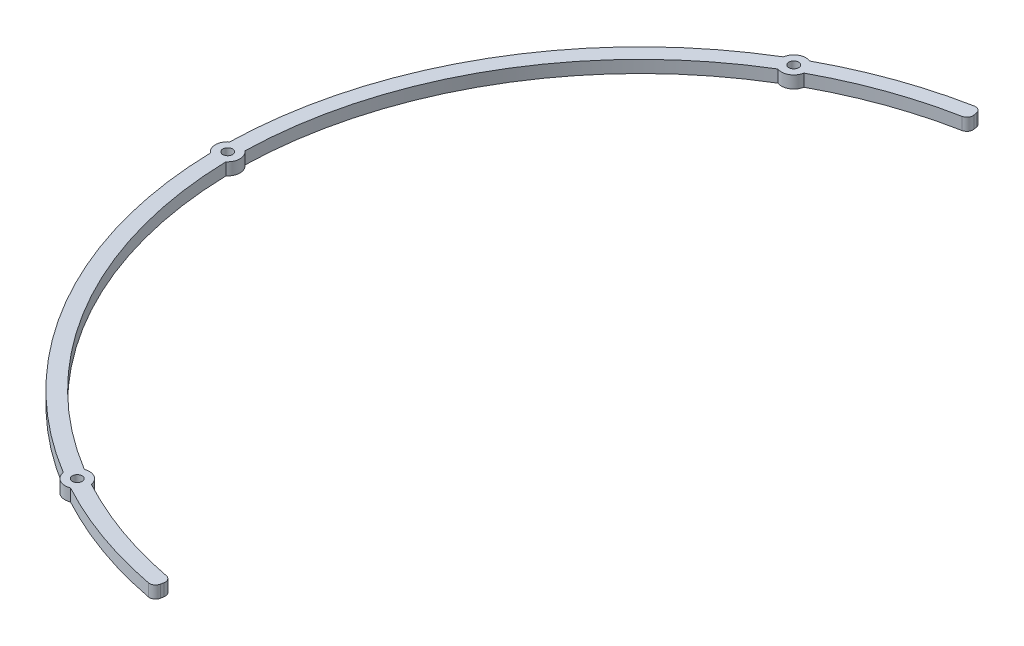
ISO-10303-21;
HEADER;
FILE_DESCRIPTION(('STEP AP214'),'2;1');
FILE_NAME('part.step','',(''),(''),'','','');
FILE_SCHEMA(('AUTOMOTIVE_DESIGN { 1 0 10303 214 1 1 1 1 }'));
ENDSEC;
DATA;
#1=APPLICATION_CONTEXT('core data for automotive mechanical design processes');
#2=APPLICATION_PROTOCOL_DEFINITION('international standard','automotive_design',2000,#1);
#3=PRODUCT_CONTEXT('',#1,'mechanical');
#4=PRODUCT('Part','Part','',(#3));
#5=PRODUCT_RELATED_PRODUCT_CATEGORY('part','',(#4));
#6=PRODUCT_DEFINITION_FORMATION('','',#4);
#7=PRODUCT_DEFINITION_CONTEXT('part definition',#1,'design');
#8=PRODUCT_DEFINITION('design','',#6,#7);
#9=PRODUCT_DEFINITION_SHAPE('','',#8);
#10=(LENGTH_UNIT() NAMED_UNIT(*) SI_UNIT(.MILLI.,.METRE.));
#11=(NAMED_UNIT(*) PLANE_ANGLE_UNIT() SI_UNIT($,.RADIAN.));
#12=(NAMED_UNIT(*) SI_UNIT($,.STERADIAN.) SOLID_ANGLE_UNIT());
#13=UNCERTAINTY_MEASURE_WITH_UNIT(LENGTH_MEASURE(1.E-05),#10,'distance_accuracy_value','');
#14=(GEOMETRIC_REPRESENTATION_CONTEXT(3) GLOBAL_UNCERTAINTY_ASSIGNED_CONTEXT((#13)) GLOBAL_UNIT_ASSIGNED_CONTEXT((#10,
#11,#12)) REPRESENTATION_CONTEXT('',''));
#15=CARTESIAN_POINT('',(0.,0.,0.));
#16=DIRECTION('',(0.,0.,1.));
#17=DIRECTION('',(1.,0.,0.));
#18=AXIS2_PLACEMENT_3D('',#15,#16,#17);
#19=CARTESIAN_POINT('',(0.,4.,0.));
#20=DIRECTION('',(0.,-1.,0.));
#21=DIRECTION('',(0.,0.,-1.));
#22=AXIS2_PLACEMENT_3D('',#19,#20,#21);
#23=CYLINDRICAL_SURFACE('',#22,137.);
#24=CARTESIAN_POINT('',(0.,0.,0.));
#25=DIRECTION('',(0.,1.,0.));
#26=DIRECTION('',(0.,0.,1.));
#27=AXIS2_PLACEMENT_3D('',#24,#25,#26);
#28=CIRCLE('',#27,137.);
#29=CARTESIAN_POINT('',(-25.7859845144308,0.,-134.551413974813));
#30=VERTEX_POINT('',#29);
#31=CARTESIAN_POINT('',(-65.2670573677867,0.,-120.454187235438));
#32=VERTEX_POINT('',#31);
#33=EDGE_CURVE('E192',#30,#32,#28,.T.);
#34=ORIENTED_EDGE('',*,*,#33,.T.);
#35=DIRECTION('',(0.,1.,0.));
#36=VECTOR('',#35,1.);
#37=CARTESIAN_POINT('',(-65.2670573677868,2.,-120.454187235438));
#38=LINE('',#37,#36);
#39=CARTESIAN_POINT('',(-65.2670573677867,4.,-120.454187235438));
#40=VERTEX_POINT('',#39);
#41=EDGE_CURVE('E67',#32,#40,#38,.T.);
#42=ORIENTED_EDGE('',*,*,#41,.T.);
#43=CARTESIAN_POINT('',(0.,4.,0.));
#44=DIRECTION('',(0.,1.,0.));
#45=DIRECTION('',(0.,0.,1.));
#46=AXIS2_PLACEMENT_3D('',#43,#44,#45);
#47=CIRCLE('',#46,137.);
#48=CARTESIAN_POINT('',(-25.7859845144308,4.,-134.551413974813));
#49=VERTEX_POINT('',#48);
#50=EDGE_CURVE('E311',#49,#40,#47,.T.);
#51=ORIENTED_EDGE('',*,*,#50,.F.);
#52=DIRECTION('',(0.,-1.,0.));
#53=VECTOR('',#52,1.);
#54=CARTESIAN_POINT('',(-25.7859845144309,4.,-134.551413974813));
#55=LINE('',#54,#53);
#56=EDGE_CURVE('E333',#49,#30,#55,.T.);
#57=ORIENTED_EDGE('',*,*,#56,.T.);
#58=EDGE_LOOP('',(#34,#42,#51,#57));
#59=FACE_BOUND('',#58,.T.);
#60=ADVANCED_FACE('F43',(#59),#23,.T.);
#61=CARTESIAN_POINT('',(0.,4.,0.));
#62=DIRECTION('',(0.,-1.,0.));
#63=DIRECTION('',(0.,0.,-1.));
#64=AXIS2_PLACEMENT_3D('',#61,#62,#63);
#65=CYLINDRICAL_SURFACE('',#64,132.);
#66=DIRECTION('',(0.,1.,0.));
#67=VECTOR('',#66,1.);
#68=CARTESIAN_POINT('',(-62.8349469227459,2.,-116.085181850293));
#69=LINE('',#68,#67);
#70=CARTESIAN_POINT('',(-62.8349469227459,0.,-116.085181850293));
#71=VERTEX_POINT('',#70);
#72=CARTESIAN_POINT('',(-62.8349469227459,4.,-116.085181850293));
#73=VERTEX_POINT('',#72);
#74=EDGE_CURVE('E201',#71,#73,#69,.T.);
#75=ORIENTED_EDGE('',*,*,#74,.F.);
#76=CARTESIAN_POINT('',(0.,0.,0.));
#77=DIRECTION('',(0.,1.,0.));
#78=DIRECTION('',(0.,0.,1.));
#79=AXIS2_PLACEMENT_3D('',#76,#77,#78);
#80=CIRCLE('',#79,132.);
#81=CARTESIAN_POINT('',(-24.8592244886957,0.,-129.638030522762));
#82=VERTEX_POINT('',#81);
#83=EDGE_CURVE('E319',#82,#71,#80,.T.);
#84=ORIENTED_EDGE('',*,*,#83,.F.);
#85=DIRECTION('',(0.,-1.,0.));
#86=VECTOR('',#85,1.);
#87=CARTESIAN_POINT('',(-24.8592244886957,4.,-129.638030522762));
#88=LINE('',#87,#86);
#89=CARTESIAN_POINT('',(-24.8592244886957,4.,-129.638030522762));
#90=VERTEX_POINT('',#89);
#91=EDGE_CURVE('E374',#82,#90,#88,.F.);
#92=ORIENTED_EDGE('',*,*,#91,.T.);
#93=CARTESIAN_POINT('',(0.,4.,0.));
#94=DIRECTION('',(0.,1.,0.));
#95=DIRECTION('',(0.,0.,1.));
#96=AXIS2_PLACEMENT_3D('',#93,#94,#95);
#97=CIRCLE('',#96,132.);
#98=EDGE_CURVE('E301',#90,#73,#97,.T.);
#99=ORIENTED_EDGE('',*,*,#98,.T.);
#100=EDGE_LOOP('',(#75,#84,#92,#99));
#101=FACE_BOUND('',#100,.T.);
#102=ADVANCED_FACE('F456',(#101),#65,.F.);
#103=CARTESIAN_POINT('',(-70.7377339790226,4.,-117.32507401026));
#104=VERTEX_POINT('',#103);
#105=CARTESIAN_POINT('',(-136.96375464684,4.,-3.15117645335468));
#106=VERTEX_POINT('',#105);
#107=EDGE_CURVE('E59',#104,#106,#47,.T.);
#108=ORIENTED_EDGE('',*,*,#107,.F.);
#109=DIRECTION('',(0.,1.,0.));
#110=VECTOR('',#109,1.);
#111=CARTESIAN_POINT('',(-70.7377339790222,2.,-117.32507401026));
#112=LINE('',#111,#110);
#113=CARTESIAN_POINT('',(-70.7377339790222,0.,-117.32507401026));
#114=VERTEX_POINT('',#113);
#115=EDGE_CURVE('E195',#104,#114,#112,.F.);
#116=ORIENTED_EDGE('',*,*,#115,.T.);
#117=CARTESIAN_POINT('',(-136.96375464684,0.,-3.15117645335468));
#118=VERTEX_POINT('',#117);
#119=EDGE_CURVE('E182',#114,#118,#28,.T.);
#120=ORIENTED_EDGE('',*,*,#119,.T.);
#121=DIRECTION('',(0.,1.,0.));
#122=VECTOR('',#121,1.);
#123=CARTESIAN_POINT('',(-136.96375464684,2.,-3.15117645335434));
#124=LINE('',#123,#122);
#125=EDGE_CURVE('E242',#118,#106,#124,.T.);
#126=ORIENTED_EDGE('',*,*,#125,.T.);
#127=EDGE_LOOP('',(#108,#116,#120,#126));
#128=FACE_BOUND('',#127,.T.);
#129=ADVANCED_FACE('F196',(#128),#23,.T.);
#130=DIRECTION('',(0.,1.,0.));
#131=VECTOR('',#130,1.);
#132=CARTESIAN_POINT('',(-68.2048523465057,2.,-113.013707648193));
#133=LINE('',#132,#131);
#134=CARTESIAN_POINT('',(-68.2048523465057,4.,-113.013707648193));
#135=VERTEX_POINT('',#134);
#136=CARTESIAN_POINT('',(-68.2048523465054,0.,-113.013707648194));
#137=VERTEX_POINT('',#136);
#138=EDGE_CURVE('E205',#135,#137,#133,.F.);
#139=ORIENTED_EDGE('',*,*,#138,.F.);
#140=CARTESIAN_POINT('',(-131.96375464684,4.,-3.09313102027258));
#141=VERTEX_POINT('',#140);
#142=EDGE_CURVE('E306',#135,#141,#97,.T.);
#143=ORIENTED_EDGE('',*,*,#142,.T.);
#144=DIRECTION('',(0.,1.,0.));
#145=VECTOR('',#144,1.);
#146=CARTESIAN_POINT('',(-131.96375464684,2.,-3.09313102027258));
#147=LINE('',#146,#145);
#148=CARTESIAN_POINT('',(-131.96375464684,0.,-3.09313102027258));
#149=VERTEX_POINT('',#148);
#150=EDGE_CURVE('E234',#149,#141,#147,.T.);
#151=ORIENTED_EDGE('',*,*,#150,.F.);
#152=EDGE_CURVE('E324',#137,#149,#80,.T.);
#153=ORIENTED_EDGE('',*,*,#152,.F.);
#154=EDGE_LOOP('',(#139,#143,#151,#153));
#155=FACE_BOUND('',#154,.T.);
#156=ADVANCED_FACE('F450',(#155),#65,.F.);
#157=CARTESIAN_POINT('',(-136.96375464684,4.,3.15117645335468));
#158=VERTEX_POINT('',#157);
#159=CARTESIAN_POINT('',(-70.7377339790226,4.,117.32507401026));
#160=VERTEX_POINT('',#159);
#161=EDGE_CURVE('E418',#158,#160,#47,.T.);
#162=ORIENTED_EDGE('',*,*,#161,.F.);
#163=DIRECTION('',(0.,1.,0.));
#164=VECTOR('',#163,1.);
#165=CARTESIAN_POINT('',(-136.96375464684,2.,3.15117645335434));
#166=LINE('',#165,#164);
#167=CARTESIAN_POINT('',(-136.96375464684,0.,3.15117645335434));
#168=VERTEX_POINT('',#167);
#169=EDGE_CURVE('E238',#158,#168,#166,.F.);
#170=ORIENTED_EDGE('',*,*,#169,.T.);
#171=CARTESIAN_POINT('',(-70.7377339790226,0.,117.32507401026));
#172=VERTEX_POINT('',#171);
#173=EDGE_CURVE('E193',#168,#172,#28,.T.);
#174=ORIENTED_EDGE('',*,*,#173,.T.);
#175=DIRECTION('',(0.,1.,0.));
#176=VECTOR('',#175,1.);
#177=CARTESIAN_POINT('',(-70.7377339790222,2.,117.32507401026));
#178=LINE('',#177,#176);
#179=EDGE_CURVE('E267',#172,#160,#178,.T.);
#180=ORIENTED_EDGE('',*,*,#179,.T.);
#181=EDGE_LOOP('',(#162,#170,#174,#180));
#182=FACE_BOUND('',#181,.T.);
#183=ADVANCED_FACE('F412',(#182),#23,.T.);
#184=DIRECTION('',(0.,1.,0.));
#185=VECTOR('',#184,1.);
#186=CARTESIAN_POINT('',(-131.96375464684,2.,3.09313102027258));
#187=LINE('',#186,#185);
#188=CARTESIAN_POINT('',(-131.96375464684,4.,3.09313102027258));
#189=VERTEX_POINT('',#188);
#190=CARTESIAN_POINT('',(-131.96375464684,0.,3.09313102027195));
#191=VERTEX_POINT('',#190);
#192=EDGE_CURVE('E225',#189,#191,#187,.F.);
#193=ORIENTED_EDGE('',*,*,#192,.F.);
#194=CARTESIAN_POINT('',(-68.2048523465057,4.,113.013707648193));
#195=VERTEX_POINT('',#194);
#196=EDGE_CURVE('E400',#189,#195,#97,.T.);
#197=ORIENTED_EDGE('',*,*,#196,.T.);
#198=DIRECTION('',(0.,1.,0.));
#199=VECTOR('',#198,1.);
#200=CARTESIAN_POINT('',(-68.2048523465057,2.,113.013707648193));
#201=LINE('',#200,#199);
#202=CARTESIAN_POINT('',(-68.2048523465057,0.,113.013707648193));
#203=VERTEX_POINT('',#202);
#204=EDGE_CURVE('E259',#203,#195,#201,.T.);
#205=ORIENTED_EDGE('',*,*,#204,.F.);
#206=EDGE_CURVE('E439',#191,#203,#80,.T.);
#207=ORIENTED_EDGE('',*,*,#206,.F.);
#208=EDGE_LOOP('',(#193,#197,#205,#207));
#209=FACE_BOUND('',#208,.T.);
#210=ADVANCED_FACE('F429',(#209),#65,.F.);
#211=CARTESIAN_POINT('',(-23.789800340369,4.,-134.918662162673));
#212=DIRECTION('',(0.984807753012209,0.,-0.173648177666927));
#213=DIRECTION('',(-0.173648177666927,0.,-0.984807753012209));
#214=AXIS2_PLACEMENT_3D('',#211,#212,#213);
#215=PLANE('',#214);
#216=DIRECTION('',(0.173648177666927,0.,0.984807753012209));
#217=VECTOR('',#216,1.);
#218=CARTESIAN_POINT('',(-23.789800340369,0.,-134.918662162673));
#219=LINE('',#218,#217);
#220=CARTESIAN_POINT('',(-23.4399312782688,0.,-132.934456111537));
#221=VERTEX_POINT('',#220);
#222=CARTESIAN_POINT('',(-23.2662638991667,0.,-131.949539461774));
#223=VERTEX_POINT('',#222);
#224=EDGE_CURVE('E281',#221,#223,#219,.T.);
#225=ORIENTED_EDGE('',*,*,#224,.F.);
#226=DIRECTION('',(0.,1.,0.));
#227=VECTOR('',#226,1.);
#228=CARTESIAN_POINT('',(-23.4399312782688,4.,-132.934456111537));
#229=LINE('',#228,#227);
#230=CARTESIAN_POINT('',(-23.4399312782688,4.,-132.934456111537));
#231=VERTEX_POINT('',#230);
#232=EDGE_CURVE('E354',#221,#231,#229,.T.);
#233=ORIENTED_EDGE('',*,*,#232,.T.);
#234=DIRECTION('',(0.173648177666927,0.,0.984807753012209));
#235=VECTOR('',#234,1.);
#236=CARTESIAN_POINT('',(-23.789800340369,4.,-134.918662162673));
#237=LINE('',#236,#235);
#238=CARTESIAN_POINT('',(-23.2662638991667,4.,-131.949539461774));
#239=VERTEX_POINT('',#238);
#240=EDGE_CURVE('E296',#231,#239,#237,.T.);
#241=ORIENTED_EDGE('',*,*,#240,.T.);
#242=DIRECTION('',(0.,-1.,0.));
#243=VECTOR('',#242,1.);
#244=CARTESIAN_POINT('',(-23.2662638991667,4.,-131.949539461774));
#245=LINE('',#244,#243);
#246=EDGE_CURVE('E350',#239,#223,#245,.T.);
#247=ORIENTED_EDGE('',*,*,#246,.T.);
#248=EDGE_LOOP('',(#225,#233,#241,#247));
#249=FACE_BOUND('',#248,.T.);
#250=ADVANCED_FACE('F464',(#249),#215,.T.);
#251=CARTESIAN_POINT('',(-65.2670573677867,4.,120.454187235438));
#252=VERTEX_POINT('',#251);
#253=CARTESIAN_POINT('',(-25.7859845144308,4.,134.551413974813));
#254=VERTEX_POINT('',#253);
#255=EDGE_CURVE('E310',#252,#254,#47,.T.);
#256=ORIENTED_EDGE('',*,*,#255,.F.);
#257=DIRECTION('',(0.,1.,0.));
#258=VECTOR('',#257,1.);
#259=CARTESIAN_POINT('',(-65.2670573677868,2.,120.454187235438));
#260=LINE('',#259,#258);
#261=CARTESIAN_POINT('',(-65.2670573677868,0.,120.454187235438));
#262=VERTEX_POINT('',#261);
#263=EDGE_CURVE('E263',#252,#262,#260,.F.);
#264=ORIENTED_EDGE('',*,*,#263,.T.);
#265=CARTESIAN_POINT('',(-25.7859845144308,0.,134.551413974813));
#266=VERTEX_POINT('',#265);
#267=EDGE_CURVE('E327',#262,#266,#28,.T.);
#268=ORIENTED_EDGE('',*,*,#267,.T.);
#269=DIRECTION('',(0.,-1.,0.));
#270=VECTOR('',#269,1.);
#271=CARTESIAN_POINT('',(-25.7859845144308,4.,134.551413974813));
#272=LINE('',#271,#270);
#273=EDGE_CURVE('E314',#266,#254,#272,.F.);
#274=ORIENTED_EDGE('',*,*,#273,.T.);
#275=EDGE_LOOP('',(#256,#264,#268,#274));
#276=FACE_BOUND('',#275,.T.);
#277=ADVANCED_FACE('F405',(#276),#23,.T.);
#278=CARTESIAN_POINT('',(-22.9215594520343,4.,129.994623397612));
#279=DIRECTION('',(0.984807753012209,0.,0.173648177666926));
#280=DIRECTION('',(0.173648177666926,0.,-0.984807753012209));
#281=AXIS2_PLACEMENT_3D('',#278,#279,#280);
#282=PLANE('',#281);
#283=DIRECTION('',(-0.173648177666926,0.,0.984807753012209));
#284=VECTOR('',#283,1.);
#285=CARTESIAN_POINT('',(-22.9215594520343,0.,129.994623397612));
#286=LINE('',#285,#284);
#287=CARTESIAN_POINT('',(-23.2662638991666,0.,131.949539461774));
#288=VERTEX_POINT('',#287);
#289=CARTESIAN_POINT('',(-23.4399312782687,0.,132.934456111537));
#290=VERTEX_POINT('',#289);
#291=EDGE_CURVE('E323',#288,#290,#286,.T.);
#292=ORIENTED_EDGE('',*,*,#291,.F.);
#293=DIRECTION('',(0.,-1.,0.));
#294=VECTOR('',#293,1.);
#295=CARTESIAN_POINT('',(-23.2662638991666,4.,131.949539461774));
#296=LINE('',#295,#294);
#297=CARTESIAN_POINT('',(-23.2662638991666,4.,131.949539461774));
#298=VERTEX_POINT('',#297);
#299=EDGE_CURVE('E11',#288,#298,#296,.F.);
#300=ORIENTED_EDGE('',*,*,#299,.T.);
#301=DIRECTION('',(-0.173648177666926,0.,0.984807753012209));
#302=VECTOR('',#301,1.);
#303=CARTESIAN_POINT('',(-22.9215594520343,4.,129.994623397612));
#304=LINE('',#303,#302);
#305=CARTESIAN_POINT('',(-23.4399312782687,4.,132.934456111537));
#306=VERTEX_POINT('',#305);
#307=EDGE_CURVE('E305',#298,#306,#304,.T.);
#308=ORIENTED_EDGE('',*,*,#307,.T.);
#309=DIRECTION('',(0.,1.,0.));
#310=VECTOR('',#309,1.);
#311=CARTESIAN_POINT('',(-23.4399312782687,0.,132.934456111537));
#312=LINE('',#311,#310);
#313=EDGE_CURVE('E52',#306,#290,#312,.F.);
#314=ORIENTED_EDGE('',*,*,#313,.T.);
#315=EDGE_LOOP('',(#292,#300,#308,#314));
#316=FACE_BOUND('',#315,.T.);
#317=ADVANCED_FACE('F381',(#316),#282,.T.);
#318=DIRECTION('',(0.,1.,0.));
#319=VECTOR('',#318,1.);
#320=CARTESIAN_POINT('',(-62.8349469227459,2.,116.085181850293));
#321=LINE('',#320,#319);
#322=CARTESIAN_POINT('',(-62.8349469227459,4.,116.085181850293));
#323=VERTEX_POINT('',#322);
#324=CARTESIAN_POINT('',(-62.8349469227467,0.,116.085181850293));
#325=VERTEX_POINT('',#324);
#326=EDGE_CURVE('E255',#323,#325,#321,.F.);
#327=ORIENTED_EDGE('',*,*,#326,.F.);
#328=CARTESIAN_POINT('',(-24.8592244886957,4.,129.638030522762));
#329=VERTEX_POINT('',#328);
#330=EDGE_CURVE('E300',#323,#329,#97,.T.);
#331=ORIENTED_EDGE('',*,*,#330,.T.);
#332=DIRECTION('',(0.,-1.,0.));
#333=VECTOR('',#332,1.);
#334=CARTESIAN_POINT('',(-24.8592244886957,4.,129.638030522762));
#335=LINE('',#334,#333);
#336=CARTESIAN_POINT('',(-24.8592244886957,0.,129.638030522762));
#337=VERTEX_POINT('',#336);
#338=EDGE_CURVE('E370',#329,#337,#335,.T.);
#339=ORIENTED_EDGE('',*,*,#338,.T.);
#340=EDGE_CURVE('E318',#325,#337,#80,.T.);
#341=ORIENTED_EDGE('',*,*,#340,.F.);
#342=EDGE_LOOP('',(#327,#331,#339,#341));
#343=FACE_BOUND('',#342,.T.);
#344=ADVANCED_FACE('F395',(#343),#65,.F.);
#345=CARTESIAN_POINT('',(0.,4.,0.));
#346=DIRECTION('',(0.,1.,0.));
#347=DIRECTION('',(0.,0.,1.));
#348=AXIS2_PLACEMENT_3D('',#345,#346,#347);
#349=PLANE('',#348);
#350=ORIENTED_EDGE('',*,*,#142,.F.);
#351=CARTESIAN_POINT('',(-66.7791434431441,4.,-116.751));
#352=DIRECTION('',(0.,1.,0.));
#353=DIRECTION('',(0.,0.,1.));
#354=AXIS2_PLACEMENT_3D('',#351,#352,#353);
#355=CIRCLE('',#354,4.00000000000001);
#356=EDGE_CURVE('E214',#135,#73,#355,.T.);
#357=ORIENTED_EDGE('',*,*,#356,.T.);
#358=ORIENTED_EDGE('',*,*,#98,.F.);
#359=CARTESIAN_POINT('',(-25.2358794051911,4.,-131.60224310644));
#360=DIRECTION('',(0.,1.,0.));
#361=DIRECTION('',(0.,0.,1.));
#362=AXIS2_PLACEMENT_3D('',#359,#360,#361);
#363=CIRCLE('',#362,2.);
#364=EDGE_CURVE('E364',#90,#239,#363,.T.);
#365=ORIENTED_EDGE('',*,*,#364,.T.);
#366=ORIENTED_EDGE('',*,*,#240,.F.);
#367=CARTESIAN_POINT('',(-25.4095467842932,4.,-132.587159756203));
#368=DIRECTION('',(0.,1.,0.));
#369=DIRECTION('',(0.,0.,1.));
#370=AXIS2_PLACEMENT_3D('',#367,#368,#369);
#371=CIRCLE('',#370,2.);
#372=EDGE_CURVE('E367',#231,#49,#371,.T.);
#373=ORIENTED_EDGE('',*,*,#372,.T.);
#374=ORIENTED_EDGE('',*,*,#50,.T.);
#375=EDGE_CURVE('E212',#40,#104,#355,.T.);
#376=ORIENTED_EDGE('',*,*,#375,.T.);
#377=ORIENTED_EDGE('',*,*,#107,.T.);
#378=CARTESIAN_POINT('',(-134.5,4.,0.));
#379=DIRECTION('',(0.,1.,0.));
#380=DIRECTION('',(0.,0.,1.));
#381=AXIS2_PLACEMENT_3D('',#378,#379,#380);
#382=CIRCLE('',#381,3.99999999999999);
#383=EDGE_CURVE('E222',#106,#158,#382,.T.);
#384=ORIENTED_EDGE('',*,*,#383,.T.);
#385=ORIENTED_EDGE('',*,*,#161,.T.);
#386=CARTESIAN_POINT('',(-66.7791434431441,4.,116.751));
#387=DIRECTION('',(0.,1.,0.));
#388=DIRECTION('',(0.,0.,1.));
#389=AXIS2_PLACEMENT_3D('',#386,#387,#388);
#390=CIRCLE('',#389,4.00000000000001);
#391=EDGE_CURVE('E245',#160,#252,#390,.T.);
#392=ORIENTED_EDGE('',*,*,#391,.T.);
#393=ORIENTED_EDGE('',*,*,#255,.T.);
#394=CARTESIAN_POINT('',(-25.4095467842931,4.,132.587159756203));
#395=DIRECTION('',(0.,1.,0.));
#396=DIRECTION('',(0.,0.,1.));
#397=AXIS2_PLACEMENT_3D('',#394,#395,#396);
#398=CIRCLE('',#397,2.);
#399=EDGE_CURVE('E357',#254,#306,#398,.T.);
#400=ORIENTED_EDGE('',*,*,#399,.T.);
#401=ORIENTED_EDGE('',*,*,#307,.F.);
#402=CARTESIAN_POINT('',(-25.2358794051911,4.,131.60224310644));
#403=DIRECTION('',(0.,1.,0.));
#404=DIRECTION('',(0.,0.,1.));
#405=AXIS2_PLACEMENT_3D('',#402,#403,#404);
#406=CIRCLE('',#405,2.);
#407=EDGE_CURVE('E360',#298,#329,#406,.T.);
#408=ORIENTED_EDGE('',*,*,#407,.T.);
#409=ORIENTED_EDGE('',*,*,#330,.F.);
#410=EDGE_CURVE('E251',#323,#195,#390,.T.);
#411=ORIENTED_EDGE('',*,*,#410,.T.);
#412=ORIENTED_EDGE('',*,*,#196,.F.);
#413=EDGE_CURVE('E227',#189,#141,#382,.T.);
#414=ORIENTED_EDGE('',*,*,#413,.T.);
#415=EDGE_LOOP('',(#350,#357,#358,#365,#366,#373,#374,#376,#377,#384,#385,#392,#393,#400,#401,
#408,#409,#411,#412,#414));
#416=FACE_BOUND('',#415,.T.);
#417=CARTESIAN_POINT('',(-66.7791434431441,4.,116.751));
#418=DIRECTION('',(0.,1.,0.));
#419=DIRECTION('',(0.,0.,-1.));
#420=AXIS2_PLACEMENT_3D('',#417,#418,#419);
#421=CIRCLE('',#420,1.60000000000001);
#422=CARTESIAN_POINT('',(-66.7791434431441,4.,115.151));
#423=VERTEX_POINT('',#422);
#424=EDGE_CURVE('E271',#423,#423,#421,.T.);
#425=ORIENTED_EDGE('',*,*,#424,.F.);
#426=EDGE_LOOP('',(#425));
#427=FACE_BOUND('',#426,.T.);
#428=CARTESIAN_POINT('',(-134.5,4.,0.));
#429=DIRECTION('',(0.,1.,0.));
#430=DIRECTION('',(0.,0.,1.));
#431=AXIS2_PLACEMENT_3D('',#428,#429,#430);
#432=CIRCLE('',#431,1.59999999999999);
#433=CARTESIAN_POINT('',(-134.5,4.,1.59999999999999));
#434=VERTEX_POINT('',#433);
#435=EDGE_CURVE('E272',#434,#434,#432,.T.);
#436=ORIENTED_EDGE('',*,*,#435,.F.);
#437=EDGE_LOOP('',(#436));
#438=FACE_BOUND('',#437,.T.);
#439=CARTESIAN_POINT('',(-66.7791434431441,4.,-116.751));
#440=DIRECTION('',(0.,1.,0.));
#441=DIRECTION('',(0.,0.,1.));
#442=AXIS2_PLACEMENT_3D('',#439,#440,#441);
#443=CIRCLE('',#442,1.60000000000001);
#444=CARTESIAN_POINT('',(-66.7791434431441,4.,-115.151));
#445=VERTEX_POINT('',#444);
#446=EDGE_CURVE('E282',#445,#445,#443,.T.);
#447=ORIENTED_EDGE('',*,*,#446,.F.);
#448=EDGE_LOOP('',(#447));
#449=FACE_BOUND('',#448,.T.);
#450=ADVANCED_FACE('F402',(#416,#427,#438,#449),#349,.T.);
#451=CARTESIAN_POINT('',(0.,0.,0.));
#452=DIRECTION('',(0.,1.,0.));
#453=DIRECTION('',(0.,0.,1.));
#454=AXIS2_PLACEMENT_3D('',#451,#452,#453);
#455=PLANE('',#454);
#456=ORIENTED_EDGE('',*,*,#119,.F.);
#457=CARTESIAN_POINT('',(-66.7791434431441,0.,-116.751));
#458=DIRECTION('',(0.,1.,0.));
#459=DIRECTION('',(0.,0.,1.));
#460=AXIS2_PLACEMENT_3D('',#457,#458,#459);
#461=CIRCLE('',#460,4.00000000000001);
#462=EDGE_CURVE('E187',#114,#32,#461,.F.);
#463=ORIENTED_EDGE('',*,*,#462,.T.);
#464=ORIENTED_EDGE('',*,*,#33,.F.);
#465=CARTESIAN_POINT('',(-25.4095467842932,0.,-132.587159756203));
#466=DIRECTION('',(0.,1.,0.));
#467=DIRECTION('',(0.,0.,1.));
#468=AXIS2_PLACEMENT_3D('',#465,#466,#467);
#469=CIRCLE('',#468,2.);
#470=EDGE_CURVE('E347',#30,#221,#469,.F.);
#471=ORIENTED_EDGE('',*,*,#470,.T.);
#472=ORIENTED_EDGE('',*,*,#224,.T.);
#473=CARTESIAN_POINT('',(-25.2358794051911,0.,-131.60224310644));
#474=DIRECTION('',(0.,1.,0.));
#475=DIRECTION('',(0.,0.,1.));
#476=AXIS2_PLACEMENT_3D('',#473,#474,#475);
#477=CIRCLE('',#476,2.);
#478=EDGE_CURVE('E344',#223,#82,#477,.F.);
#479=ORIENTED_EDGE('',*,*,#478,.T.);
#480=ORIENTED_EDGE('',*,*,#83,.T.);
#481=EDGE_CURVE('E206',#71,#137,#461,.F.);
#482=ORIENTED_EDGE('',*,*,#481,.T.);
#483=ORIENTED_EDGE('',*,*,#152,.T.);
#484=CARTESIAN_POINT('',(-134.5,0.,0.));
#485=DIRECTION('',(0.,1.,0.));
#486=DIRECTION('',(0.,0.,1.));
#487=AXIS2_PLACEMENT_3D('',#484,#485,#486);
#488=CIRCLE('',#487,3.99999999999999);
#489=EDGE_CURVE('E226',#149,#191,#488,.F.);
#490=ORIENTED_EDGE('',*,*,#489,.T.);
#491=ORIENTED_EDGE('',*,*,#206,.T.);
#492=CARTESIAN_POINT('',(-66.7791434431441,0.,116.751));
#493=DIRECTION('',(0.,1.,0.));
#494=DIRECTION('',(0.,0.,1.));
#495=AXIS2_PLACEMENT_3D('',#492,#493,#494);
#496=CIRCLE('',#495,4.00000000000001);
#497=EDGE_CURVE('E250',#203,#325,#496,.F.);
#498=ORIENTED_EDGE('',*,*,#497,.T.);
#499=ORIENTED_EDGE('',*,*,#340,.T.);
#500=CARTESIAN_POINT('',(-25.2358794051911,0.,131.60224310644));
#501=DIRECTION('',(0.,1.,0.));
#502=DIRECTION('',(0.,0.,1.));
#503=AXIS2_PLACEMENT_3D('',#500,#501,#502);
#504=CIRCLE('',#503,2.);
#505=EDGE_CURVE('E341',#337,#288,#504,.F.);
#506=ORIENTED_EDGE('',*,*,#505,.T.);
#507=ORIENTED_EDGE('',*,*,#291,.T.);
#508=CARTESIAN_POINT('',(-25.4095467842931,0.,132.587159756203));
#509=DIRECTION('',(0.,1.,0.));
#510=DIRECTION('',(0.,0.,1.));
#511=AXIS2_PLACEMENT_3D('',#508,#509,#510);
#512=CIRCLE('',#511,2.);
#513=EDGE_CURVE('E337',#290,#266,#512,.F.);
#514=ORIENTED_EDGE('',*,*,#513,.T.);
#515=ORIENTED_EDGE('',*,*,#267,.F.);
#516=EDGE_CURVE('E246',#262,#172,#496,.F.);
#517=ORIENTED_EDGE('',*,*,#516,.T.);
#518=ORIENTED_EDGE('',*,*,#173,.F.);
#519=EDGE_CURVE('E189',#168,#118,#488,.F.);
#520=ORIENTED_EDGE('',*,*,#519,.T.);
#521=EDGE_LOOP('',(#456,#463,#464,#471,#472,#479,#480,#482,#483,#490,#491,#498,#499,#506,#507,
#514,#515,#517,#518,#520));
#522=FACE_BOUND('',#521,.T.);
#523=CARTESIAN_POINT('',(-66.7791434431441,0.,116.751));
#524=DIRECTION('',(0.,1.,0.));
#525=DIRECTION('',(0.,0.,1.));
#526=AXIS2_PLACEMENT_3D('',#523,#524,#525);
#527=CIRCLE('',#526,1.60000000000001);
#528=CARTESIAN_POINT('',(-66.7791434431441,0.,118.351));
#529=VERTEX_POINT('',#528);
#530=EDGE_CURVE('E286',#529,#529,#527,.F.);
#531=ORIENTED_EDGE('',*,*,#530,.F.);
#532=EDGE_LOOP('',(#531));
#533=FACE_BOUND('',#532,.T.);
#534=CARTESIAN_POINT('',(-134.5,0.,0.));
#535=DIRECTION('',(0.,1.,0.));
#536=DIRECTION('',(0.,0.,1.));
#537=AXIS2_PLACEMENT_3D('',#534,#535,#536);
#538=CIRCLE('',#537,1.59999999999999);
#539=CARTESIAN_POINT('',(-134.5,0.,1.59999999999999));
#540=VERTEX_POINT('',#539);
#541=EDGE_CURVE('E276',#540,#540,#538,.F.);
#542=ORIENTED_EDGE('',*,*,#541,.F.);
#543=EDGE_LOOP('',(#542));
#544=FACE_BOUND('',#543,.T.);
#545=CARTESIAN_POINT('',(-66.7791434431441,0.,-116.751));
#546=DIRECTION('',(0.,1.,0.));
#547=DIRECTION('',(0.,0.,1.));
#548=AXIS2_PLACEMENT_3D('',#545,#546,#547);
#549=CIRCLE('',#548,1.60000000000001);
#550=CARTESIAN_POINT('',(-66.7791434431441,0.,-115.151));
#551=VERTEX_POINT('',#550);
#552=EDGE_CURVE('E277',#551,#551,#549,.F.);
#553=ORIENTED_EDGE('',*,*,#552,.F.);
#554=EDGE_LOOP('',(#553));
#555=FACE_BOUND('',#554,.T.);
#556=ADVANCED_FACE('F183',(#522,#533,#544,#555),#455,.F.);
#557=CARTESIAN_POINT('',(-25.4095467842932,4.,-132.587159756203));
#558=DIRECTION('',(0.,-1.,0.));
#559=DIRECTION('',(0.,0.,-1.));
#560=AXIS2_PLACEMENT_3D('',#557,#558,#559);
#561=CYLINDRICAL_SURFACE('',#560,2.);
#562=ORIENTED_EDGE('',*,*,#372,.F.);
#563=ORIENTED_EDGE('',*,*,#232,.F.);
#564=ORIENTED_EDGE('',*,*,#470,.F.);
#565=ORIENTED_EDGE('',*,*,#56,.F.);
#566=EDGE_LOOP('',(#562,#563,#564,#565));
#567=FACE_BOUND('',#566,.T.);
#568=ADVANCED_FACE('F470',(#567),#561,.T.);
#569=CARTESIAN_POINT('',(-25.2358794051911,4.,-131.60224310644));
#570=DIRECTION('',(0.,-1.,0.));
#571=DIRECTION('',(0.,0.,-1.));
#572=AXIS2_PLACEMENT_3D('',#569,#570,#571);
#573=CYLINDRICAL_SURFACE('',#572,2.);
#574=ORIENTED_EDGE('',*,*,#364,.F.);
#575=ORIENTED_EDGE('',*,*,#91,.F.);
#576=ORIENTED_EDGE('',*,*,#478,.F.);
#577=ORIENTED_EDGE('',*,*,#246,.F.);
#578=EDGE_LOOP('',(#574,#575,#576,#577));
#579=FACE_BOUND('',#578,.T.);
#580=ADVANCED_FACE('F462',(#579),#573,.T.);
#581=CARTESIAN_POINT('',(-25.2358794051911,4.,131.60224310644));
#582=DIRECTION('',(0.,-1.,0.));
#583=DIRECTION('',(0.,0.,-1.));
#584=AXIS2_PLACEMENT_3D('',#581,#582,#583);
#585=CYLINDRICAL_SURFACE('',#584,2.);
#586=ORIENTED_EDGE('',*,*,#407,.F.);
#587=ORIENTED_EDGE('',*,*,#299,.F.);
#588=ORIENTED_EDGE('',*,*,#505,.F.);
#589=ORIENTED_EDGE('',*,*,#338,.F.);
#590=EDGE_LOOP('',(#586,#587,#588,#589));
#591=FACE_BOUND('',#590,.T.);
#592=ADVANCED_FACE('F392',(#591),#585,.T.);
#593=CARTESIAN_POINT('',(-25.4095467842931,4.,132.587159756203));
#594=DIRECTION('',(0.,-1.,0.));
#595=DIRECTION('',(0.,0.,-1.));
#596=AXIS2_PLACEMENT_3D('',#593,#594,#595);
#597=CYLINDRICAL_SURFACE('',#596,2.);
#598=ORIENTED_EDGE('',*,*,#399,.F.);
#599=ORIENTED_EDGE('',*,*,#273,.F.);
#600=ORIENTED_EDGE('',*,*,#513,.F.);
#601=ORIENTED_EDGE('',*,*,#313,.F.);
#602=EDGE_LOOP('',(#598,#599,#600,#601));
#603=FACE_BOUND('',#602,.T.);
#604=ADVANCED_FACE('F45',(#603),#597,.T.);
#605=CARTESIAN_POINT('',(-66.7791434431441,-0.00100000000000013,116.751));
#606=DIRECTION('',(0.,1.,0.));
#607=DIRECTION('',(0.,0.,1.));
#608=AXIS2_PLACEMENT_3D('',#605,#606,#607);
#609=CYLINDRICAL_SURFACE('',#608,1.60000000000001);
#610=ORIENTED_EDGE('',*,*,#424,.T.);
#611=EDGE_LOOP('',(#610));
#612=FACE_BOUND('',#611,.T.);
#613=ORIENTED_EDGE('',*,*,#530,.T.);
#614=EDGE_LOOP('',(#613));
#615=FACE_BOUND('',#614,.T.);
#616=ADVANCED_FACE('F513',(#612,#615),#609,.F.);
#617=CARTESIAN_POINT('',(-66.7791434431441,-0.00100000000000013,-116.751));
#618=DIRECTION('',(0.,1.,0.));
#619=DIRECTION('',(0.,0.,1.));
#620=AXIS2_PLACEMENT_3D('',#617,#618,#619);
#621=CYLINDRICAL_SURFACE('',#620,1.60000000000001);
#622=ORIENTED_EDGE('',*,*,#446,.T.);
#623=EDGE_LOOP('',(#622));
#624=FACE_BOUND('',#623,.T.);
#625=ORIENTED_EDGE('',*,*,#552,.T.);
#626=EDGE_LOOP('',(#625));
#627=FACE_BOUND('',#626,.T.);
#628=ADVANCED_FACE('F517',(#624,#627),#621,.F.);
#629=CARTESIAN_POINT('',(-134.5,-0.00100000000000013,0.));
#630=DIRECTION('',(0.,1.,0.));
#631=DIRECTION('',(0.,0.,1.));
#632=AXIS2_PLACEMENT_3D('',#629,#630,#631);
#633=CYLINDRICAL_SURFACE('',#632,1.59999999999999);
#634=ORIENTED_EDGE('',*,*,#435,.T.);
#635=EDGE_LOOP('',(#634));
#636=FACE_BOUND('',#635,.T.);
#637=ORIENTED_EDGE('',*,*,#541,.T.);
#638=EDGE_LOOP('',(#637));
#639=FACE_BOUND('',#638,.T.);
#640=ADVANCED_FACE('F523',(#636,#639),#633,.F.);
#641=CARTESIAN_POINT('',(-66.7791434431441,-11.3137084989848,116.751));
#642=DIRECTION('',(0.,1.,0.));
#643=DIRECTION('',(0.,0.,1.));
#644=AXIS2_PLACEMENT_3D('',#641,#642,#643);
#645=CYLINDRICAL_SURFACE('',#644,4.00000000000001);
#646=ORIENTED_EDGE('',*,*,#497,.F.);
#647=ORIENTED_EDGE('',*,*,#204,.T.);
#648=ORIENTED_EDGE('',*,*,#410,.F.);
#649=ORIENTED_EDGE('',*,*,#326,.T.);
#650=EDGE_LOOP('',(#646,#647,#648,#649));
#651=FACE_BOUND('',#650,.T.);
#652=ADVANCED_FACE('F433',(#651),#645,.T.);
#653=ORIENTED_EDGE('',*,*,#179,.F.);
#654=ORIENTED_EDGE('',*,*,#516,.F.);
#655=ORIENTED_EDGE('',*,*,#263,.F.);
#656=ORIENTED_EDGE('',*,*,#391,.F.);
#657=EDGE_LOOP('',(#653,#654,#655,#656));
#658=FACE_BOUND('',#657,.T.);
#659=ADVANCED_FACE('F416',(#658),#645,.T.);
#660=CARTESIAN_POINT('',(-134.5,-11.3137084989848,0.));
#661=DIRECTION('',(0.,1.,0.));
#662=DIRECTION('',(0.,0.,1.));
#663=AXIS2_PLACEMENT_3D('',#660,#661,#662);
#664=CYLINDRICAL_SURFACE('',#663,3.99999999999999);
#665=ORIENTED_EDGE('',*,*,#489,.F.);
#666=ORIENTED_EDGE('',*,*,#150,.T.);
#667=ORIENTED_EDGE('',*,*,#413,.F.);
#668=ORIENTED_EDGE('',*,*,#192,.T.);
#669=EDGE_LOOP('',(#665,#666,#667,#668));
#670=FACE_BOUND('',#669,.T.);
#671=ADVANCED_FACE('F443',(#670),#664,.T.);
#672=ORIENTED_EDGE('',*,*,#125,.F.);
#673=ORIENTED_EDGE('',*,*,#519,.F.);
#674=ORIENTED_EDGE('',*,*,#169,.F.);
#675=ORIENTED_EDGE('',*,*,#383,.F.);
#676=EDGE_LOOP('',(#672,#673,#674,#675));
#677=FACE_BOUND('',#676,.T.);
#678=ADVANCED_FACE('F473',(#677),#664,.T.);
#679=CARTESIAN_POINT('',(-66.7791434431441,-11.3137084989848,-116.751));
#680=DIRECTION('',(0.,1.,0.));
#681=DIRECTION('',(0.,0.,1.));
#682=AXIS2_PLACEMENT_3D('',#679,#680,#681);
#683=CYLINDRICAL_SURFACE('',#682,4.00000000000001);
#684=ORIENTED_EDGE('',*,*,#481,.F.);
#685=ORIENTED_EDGE('',*,*,#74,.T.);
#686=ORIENTED_EDGE('',*,*,#356,.F.);
#687=ORIENTED_EDGE('',*,*,#138,.T.);
#688=EDGE_LOOP('',(#684,#685,#686,#687));
#689=FACE_BOUND('',#688,.T.);
#690=ADVANCED_FACE('F452',(#689),#683,.T.);
#691=ORIENTED_EDGE('',*,*,#41,.F.);
#692=ORIENTED_EDGE('',*,*,#462,.F.);
#693=ORIENTED_EDGE('',*,*,#115,.F.);
#694=ORIENTED_EDGE('',*,*,#375,.F.);
#695=EDGE_LOOP('',(#691,#692,#693,#694));
#696=FACE_BOUND('',#695,.T.);
#697=ADVANCED_FACE('F203',(#696),#683,.T.);
#698=CLOSED_SHELL('',(#60,#102,#129,#156,#183,#210,#250,#277,#317,#344,#450,#556,#568,#580,#592,
#604,#616,#628,#640,#652,#659,#671,#678,#690,#697));
#699=MANIFOLD_SOLID_BREP('B2',#698);
#700=ADVANCED_BREP_SHAPE_REPRESENTATION('',(#18,#699),#14);
#701=SHAPE_DEFINITION_REPRESENTATION(#9,#700);
ENDSEC;
END-ISO-10303-21;
